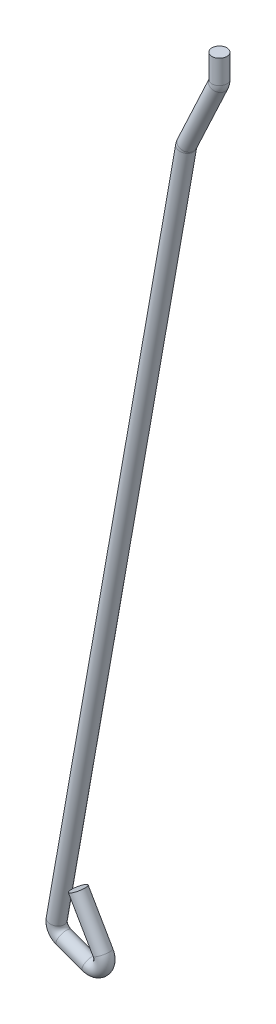
ISO-10303-21;
HEADER;
FILE_DESCRIPTION(('STEP AP214'),'2;1');
FILE_NAME('part.step','',(''),(''),'','','');
FILE_SCHEMA(('AUTOMOTIVE_DESIGN { 1 0 10303 214 1 1 1 1 }'));
ENDSEC;
DATA;
#1=APPLICATION_CONTEXT('core data for automotive mechanical design processes');
#2=APPLICATION_PROTOCOL_DEFINITION('international standard','automotive_design',2000,#1);
#3=PRODUCT_CONTEXT('',#1,'mechanical');
#4=PRODUCT('Part','Part','',(#3));
#5=PRODUCT_RELATED_PRODUCT_CATEGORY('part','',(#4));
#6=PRODUCT_DEFINITION_FORMATION('','',#4);
#7=PRODUCT_DEFINITION_CONTEXT('part definition',#1,'design');
#8=PRODUCT_DEFINITION('design','',#6,#7);
#9=PRODUCT_DEFINITION_SHAPE('','',#8);
#10=(LENGTH_UNIT() NAMED_UNIT(*) SI_UNIT(.MILLI.,.METRE.));
#11=(NAMED_UNIT(*) PLANE_ANGLE_UNIT() SI_UNIT($,.RADIAN.));
#12=(NAMED_UNIT(*) SI_UNIT($,.STERADIAN.) SOLID_ANGLE_UNIT());
#13=UNCERTAINTY_MEASURE_WITH_UNIT(LENGTH_MEASURE(1.E-05),#10,'distance_accuracy_value','');
#14=(GEOMETRIC_REPRESENTATION_CONTEXT(3) GLOBAL_UNCERTAINTY_ASSIGNED_CONTEXT((#13)) GLOBAL_UNIT_ASSIGNED_CONTEXT((#10,
#11,#12)) REPRESENTATION_CONTEXT('',''));
#15=CARTESIAN_POINT('',(0.,0.,0.));
#16=DIRECTION('',(0.,0.,1.));
#17=DIRECTION('',(1.,0.,0.));
#18=AXIS2_PLACEMENT_3D('',#15,#16,#17);
#19=CARTESIAN_POINT('',(-0.0594945552317272,0.,0.));
#20=DIRECTION('',(0.,1.,0.));
#21=DIRECTION('',(0.,0.,1.));
#22=AXIS2_PLACEMENT_3D('',#19,#20,#21);
#23=PLANE('',#22);
#24=CARTESIAN_POINT('',(-0.0594945552317272,0.,0.));
#25=DIRECTION('',(0.,1.,0.));
#26=DIRECTION('',(0.,0.,1.));
#27=AXIS2_PLACEMENT_3D('',#24,#25,#26);
#28=CIRCLE('',#27,0.9144);
#29=CARTESIAN_POINT('',(-0.0594945552317272,0.,0.9144));
#30=VERTEX_POINT('',#29);
#31=EDGE_CURVE('E77',#30,#30,#28,.T.);
#32=ORIENTED_EDGE('',*,*,#31,.T.);
#33=EDGE_LOOP('',(#32));
#34=FACE_BOUND('',#33,.T.);
#35=ADVANCED_FACE('F43',(#34),#23,.T.);
#36=CARTESIAN_POINT('',(-17.2662609280572,-96.919901169108,0.));
#37=DIRECTION('',(0.500000000000007,-0.866025403784434,0.));
#38=DIRECTION('',(0.,0.,1.));
#39=AXIS2_PLACEMENT_3D('',#36,#37,#38);
#40=PLANE('',#39);
#41=CARTESIAN_POINT('',(-17.2662609280572,-96.919901169108,0.));
#42=DIRECTION('',(0.500000000000007,-0.866025403784434,0.));
#43=DIRECTION('',(0.,0.,1.));
#44=AXIS2_PLACEMENT_3D('',#41,#42,#43);
#45=CIRCLE('',#44,0.9144);
#46=CARTESIAN_POINT('',(-17.2662609280572,-96.919901169108,0.9144));
#47=VERTEX_POINT('',#46);
#48=EDGE_CURVE('E12',#47,#47,#45,.T.);
#49=ORIENTED_EDGE('',*,*,#48,.F.);
#50=EDGE_LOOP('',(#49));
#51=FACE_BOUND('',#50,.T.);
#52=ADVANCED_FACE('F85',(#51),#40,.F.);
#53=CARTESIAN_POINT('',(-0.0594945552317272,0.,0.));
#54=DIRECTION('',(0.,-1.,0.));
#55=DIRECTION('',(1.,0.,0.));
#56=AXIS2_PLACEMENT_3D('',#53,#54,#55);
#57=CYLINDRICAL_SURFACE('',#56,0.9144);
#58=CARTESIAN_POINT('',(-0.0594945552317269,-2.89344777844347,0.));
#59=DIRECTION('',(0.,1.,0.));
#60=DIRECTION('',(0.,0.,1.));
#61=AXIS2_PLACEMENT_3D('',#58,#59,#60);
#62=CIRCLE('',#61,0.9144);
#63=CARTESIAN_POINT('',(0.854905444768273,-2.89344777844347,0.));
#64=VERTEX_POINT('',#63);
#65=EDGE_CURVE('E74',#64,#64,#62,.T.);
#66=ORIENTED_EDGE('',*,*,#65,.T.);
#67=EDGE_LOOP('',(#66));
#68=FACE_BOUND('',#67,.T.);
#69=ORIENTED_EDGE('',*,*,#31,.F.);
#70=EDGE_LOOP('',(#69));
#71=FACE_BOUND('',#70,.T.);
#72=ADVANCED_FACE('F82',(#68,#71),#57,.T.);
#73=CARTESIAN_POINT('',(-1.27,-2.89344777844347,0.));
#74=DIRECTION('',(0.,0.,-1.));
#75=DIRECTION('',(-1.,0.,0.));
#76=AXIS2_PLACEMENT_3D('',#73,#74,#75);
#77=TOROIDAL_SURFACE('',#76,1.21050544476827,0.9144);
#78=CARTESIAN_POINT('',(-0.172909489156251,-3.40502948533909,0.));
#79=DIRECTION('',(0.422618261740701,0.906307787036649,0.));
#80=DIRECTION('',(0.,0.,1.));
#81=AXIS2_PLACEMENT_3D('',#78,#79,#80);
#82=CIRCLE('',#81,0.9144);
#83=CARTESIAN_POINT('',(0.655818351310061,-3.79147162387478,0.));
#84=VERTEX_POINT('',#83);
#85=EDGE_CURVE('E71',#84,#84,#82,.T.);
#86=CARTESIAN_POINT('',(-1.27,-2.89344777844347,0.));
#87=DIRECTION('',(0.,0.,-1.));
#88=DIRECTION('',(-1.,0.,0.));
#89=AXIS2_PLACEMENT_3D('',#86,#87,#88);
#90=CIRCLE('',#89,2.12490544476827);
#91=EDGE_CURVE('',#64,#84,#90,.T.);
#92=ORIENTED_EDGE('',*,*,#65,.F.);
#93=ORIENTED_EDGE('',*,*,#85,.T.);
#94=ORIENTED_EDGE('',*,*,#91,.T.);
#95=ORIENTED_EDGE('',*,*,#91,.F.);
#96=EDGE_LOOP('',(#92,#94,#93,#95));
#97=FACE_BOUND('',#96,.T.);
#98=ADVANCED_FACE('F84',(#97),#77,.T.);
#99=CARTESIAN_POINT('',(-0.172909489156251,-3.40502948533909,0.));
#100=DIRECTION('',(-0.4226182617407,-0.90630778703665,0.));
#101=DIRECTION('',(0.90630778703665,-0.4226182617407,0.));
#102=AXIS2_PLACEMENT_3D('',#99,#100,#101);
#103=CYLINDRICAL_SURFACE('',#102,0.9144);
#104=CARTESIAN_POINT('',(-4.00869810967403,-11.6309047276512,0.));
#105=DIRECTION('',(0.4226182617407,0.906307787036649,0.));
#106=DIRECTION('',(0.,0.,1.));
#107=AXIS2_PLACEMENT_3D('',#104,#105,#106);
#108=CIRCLE('',#107,0.9144);
#109=CARTESIAN_POINT('',(-4.83742595014034,-11.2444625891156,0.));
#110=VERTEX_POINT('',#109);
#111=EDGE_CURVE('E68',#110,#110,#108,.T.);
#112=ORIENTED_EDGE('',*,*,#111,.T.);
#113=EDGE_LOOP('',(#112));
#114=FACE_BOUND('',#113,.T.);
#115=ORIENTED_EDGE('',*,*,#85,.F.);
#116=EDGE_LOOP('',(#115));
#117=FACE_BOUND('',#116,.T.);
#118=ADVANCED_FACE('F92',(#114,#117),#103,.T.);
#119=CARTESIAN_POINT('',(-2.80376684144468,-12.192773405577,0.));
#120=DIRECTION('',(0.,0.,1.));
#121=DIRECTION('',(1.,0.,0.));
#122=AXIS2_PLACEMENT_3D('',#119,#120,#121);
#123=TOROIDAL_SURFACE('',#122,1.32949455523173,0.9144);
#124=CARTESIAN_POINT('',(-4.1130633870244,-11.9619090988429,0.));
#125=DIRECTION('',(0.173648177666931,0.984807753012208,0.));
#126=DIRECTION('',(0.,0.,1.));
#127=AXIS2_PLACEMENT_3D('',#124,#125,#126);
#128=CIRCLE('',#127,0.9144);
#129=CARTESIAN_POINT('',(-5.01357159637877,-11.8031252051843,0.));
#130=VERTEX_POINT('',#129);
#131=EDGE_CURVE('E65',#130,#130,#128,.T.);
#132=CARTESIAN_POINT('',(-2.80376684144468,-12.192773405577,0.));
#133=DIRECTION('',(0.,0.,1.));
#134=DIRECTION('',(1.,0.,0.));
#135=AXIS2_PLACEMENT_3D('',#132,#133,#134);
#136=CIRCLE('',#135,2.24389455523173);
#137=EDGE_CURVE('',#110,#130,#136,.T.);
#138=ORIENTED_EDGE('',*,*,#111,.F.);
#139=ORIENTED_EDGE('',*,*,#131,.T.);
#140=ORIENTED_EDGE('',*,*,#137,.T.);
#141=ORIENTED_EDGE('',*,*,#137,.F.);
#142=EDGE_LOOP('',(#138,#140,#139,#141));
#143=FACE_BOUND('',#142,.T.);
#144=ADVANCED_FACE('F117',(#143),#123,.T.);
#145=CARTESIAN_POINT('',(-4.1130633870244,-11.9619090988429,0.));
#146=DIRECTION('',(-0.173648177666931,-0.984807753012208,0.));
#147=DIRECTION('',(0.984807753012208,-0.173648177666931,0.));
#148=AXIS2_PLACEMENT_3D('',#145,#146,#147);
#149=CYLINDRICAL_SURFACE('',#148,0.9144);
#150=CARTESIAN_POINT('',(-19.8876362862867,-101.423957594663,0.));
#151=DIRECTION('',(0.173648177666931,0.984807753012208,0.));
#152=DIRECTION('',(0.,0.,1.));
#153=AXIS2_PLACEMENT_3D('',#150,#151,#152);
#154=CIRCLE('',#153,0.9144);
#155=CARTESIAN_POINT('',(-20.788144495641,-101.265173701004,0.));
#156=VERTEX_POINT('',#155);
#157=EDGE_CURVE('E62',#156,#156,#154,.T.);
#158=ORIENTED_EDGE('',*,*,#157,.T.);
#159=EDGE_LOOP('',(#158));
#160=FACE_BOUND('',#159,.T.);
#161=ORIENTED_EDGE('',*,*,#131,.F.);
#162=EDGE_LOOP('',(#161));
#163=FACE_BOUND('',#162,.T.);
#164=ADVANCED_FACE('F113',(#160,#163),#149,.T.);
#165=CARTESIAN_POINT('',(-18.5783397407069,-101.654821901397,0.));
#166=DIRECTION('',(0.,0.,1.));
#167=DIRECTION('',(1.,0.,0.));
#168=AXIS2_PLACEMENT_3D('',#165,#166,#167);
#169=TOROIDAL_SURFACE('',#168,1.32949455523173,0.9144);
#170=CARTESIAN_POINT('',(-19.033053659038,-102.904138124323,0.));
#171=DIRECTION('',(-0.939692620785909,0.342020143325668,0.));
#172=DIRECTION('',(0.,0.,1.));
#173=AXIS2_PLACEMENT_3D('',#170,#171,#172);
#174=CIRCLE('',#173,0.9144);
#175=CARTESIAN_POINT('',(-19.345796878095,-103.76339305677,0.));
#176=VERTEX_POINT('',#175);
#177=EDGE_CURVE('E57',#176,#176,#174,.T.);
#178=CARTESIAN_POINT('',(-18.5783397407069,-101.654821901397,0.));
#179=DIRECTION('',(0.,0.,1.));
#180=DIRECTION('',(1.,0.,0.));
#181=AXIS2_PLACEMENT_3D('',#178,#179,#180);
#182=CIRCLE('',#181,2.24389455523173);
#183=EDGE_CURVE('',#156,#176,#182,.T.);
#184=ORIENTED_EDGE('',*,*,#157,.F.);
#185=ORIENTED_EDGE('',*,*,#177,.T.);
#186=ORIENTED_EDGE('',*,*,#183,.T.);
#187=ORIENTED_EDGE('',*,*,#183,.F.);
#188=EDGE_LOOP('',(#184,#186,#185,#187));
#189=FACE_BOUND('',#188,.T.);
#190=ADVANCED_FACE('F109',(#189),#169,.T.);
#191=CARTESIAN_POINT('',(-19.033053659038,-102.904138124323,0.));
#192=DIRECTION('',(0.93969262078591,-0.342020143325665,0.));
#193=DIRECTION('',(0.342020143325665,0.93969262078591,0.));
#194=AXIS2_PLACEMENT_3D('',#191,#192,#193);
#195=CYLINDRICAL_SURFACE('',#194,0.9144);
#196=CARTESIAN_POINT('',(-15.8544990667656,-104.061037383901,0.));
#197=DIRECTION('',(-0.93969262078591,0.342020143325666,0.));
#198=DIRECTION('',(0.,0.,1.));
#199=AXIS2_PLACEMENT_3D('',#196,#197,#198);
#200=CIRCLE('',#199,0.9144);
#201=CARTESIAN_POINT('',(-16.1672422858226,-104.920292316347,0.));
#202=VERTEX_POINT('',#201);
#203=EDGE_CURVE('E53',#202,#202,#200,.T.);
#204=ORIENTED_EDGE('',*,*,#203,.T.);
#205=EDGE_LOOP('',(#204));
#206=FACE_BOUND('',#205,.T.);
#207=ORIENTED_EDGE('',*,*,#177,.F.);
#208=EDGE_LOOP('',(#207));
#209=FACE_BOUND('',#208,.T.);
#210=ADVANCED_FACE('F103',(#206,#209),#195,.T.);
#211=CARTESIAN_POINT('',(-15.3997851484346,-102.811721160974,0.));
#212=DIRECTION('',(0.,0.,1.));
#213=DIRECTION('',(1.,0.,0.));
#214=AXIS2_PLACEMENT_3D('',#211,#212,#213);
#215=TOROIDAL_SURFACE('',#214,1.32949455523174,0.9144);
#216=CARTESIAN_POINT('',(-14.2484090894109,-102.146973883359,0.));
#217=DIRECTION('',(0.499999999999996,-0.866025403784441,0.));
#218=DIRECTION('',(0.,0.,1.));
#219=AXIS2_PLACEMENT_3D('',#216,#217,#218);
#220=CIRCLE('',#219,0.9144);
#221=CARTESIAN_POINT('',(-13.4565154601904,-101.689773883359,0.));
#222=VERTEX_POINT('',#221);
#223=EDGE_CURVE('E49',#222,#222,#220,.T.);
#224=CARTESIAN_POINT('',(-15.3997851484346,-102.811721160974,0.));
#225=DIRECTION('',(0.,0.,1.));
#226=DIRECTION('',(1.,0.,0.));
#227=AXIS2_PLACEMENT_3D('',#224,#225,#226);
#228=CIRCLE('',#227,2.24389455523174);
#229=EDGE_CURVE('',#202,#222,#228,.T.);
#230=ORIENTED_EDGE('',*,*,#203,.F.);
#231=ORIENTED_EDGE('',*,*,#223,.T.);
#232=ORIENTED_EDGE('',*,*,#229,.T.);
#233=ORIENTED_EDGE('',*,*,#229,.F.);
#234=EDGE_LOOP('',(#230,#232,#231,#233));
#235=FACE_BOUND('',#234,.T.);
#236=ADVANCED_FACE('F98',(#235),#215,.T.);
#237=CARTESIAN_POINT('',(-14.2484090894108,-102.146973883359,0.));
#238=DIRECTION('',(-0.500000000000007,0.866025403784434,0.));
#239=DIRECTION('',(-0.866025403784434,-0.500000000000007,0.));
#240=AXIS2_PLACEMENT_3D('',#237,#238,#239);
#241=CYLINDRICAL_SURFACE('',#240,0.9144);
#242=ORIENTED_EDGE('',*,*,#48,.T.);
#243=EDGE_LOOP('',(#242));
#244=FACE_BOUND('',#243,.T.);
#245=ORIENTED_EDGE('',*,*,#223,.F.);
#246=EDGE_LOOP('',(#245));
#247=FACE_BOUND('',#246,.T.);
#248=ADVANCED_FACE('F96',(#244,#247),#241,.T.);
#249=CLOSED_SHELL('',(#35,#52,#72,#98,#118,#144,#164,#190,#210,#236,#248));
#250=MANIFOLD_SOLID_BREP('B2',#249);
#251=ADVANCED_BREP_SHAPE_REPRESENTATION('',(#18,#250),#14);
#252=SHAPE_DEFINITION_REPRESENTATION(#9,#251);
ENDSEC;
END-ISO-10303-21;
